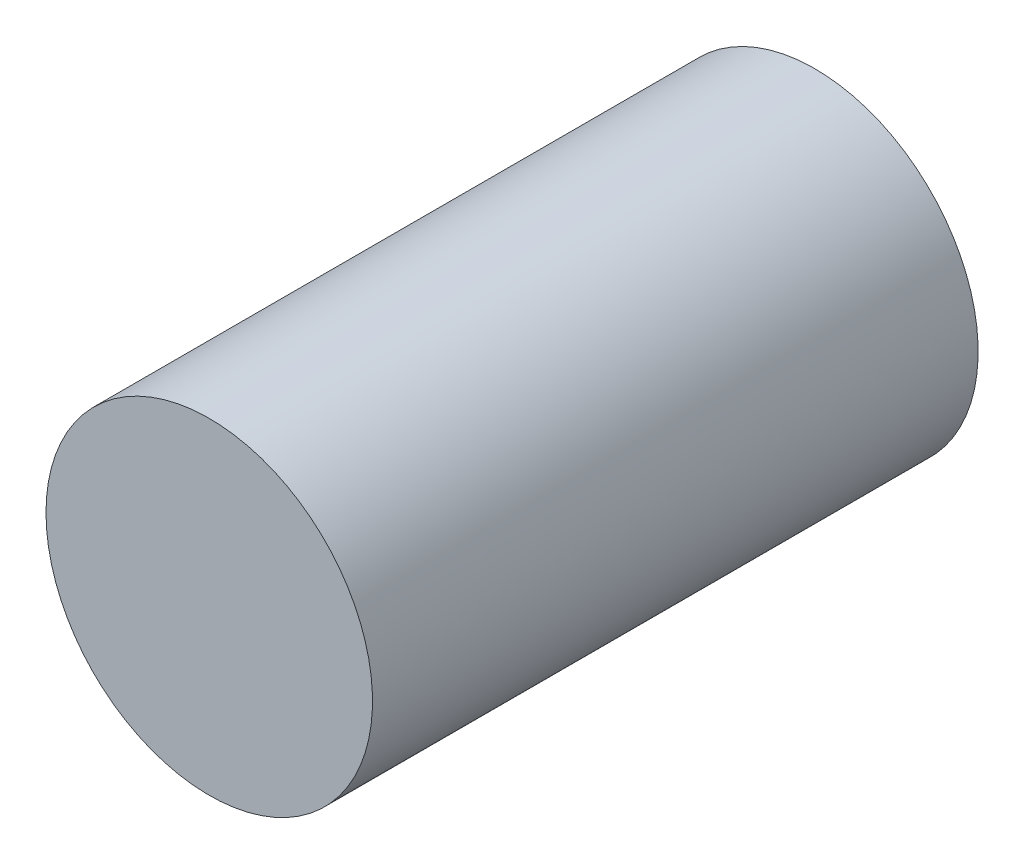
ISO-10303-21;
HEADER;
FILE_DESCRIPTION(('STEP AP214'),'2;1');
FILE_NAME('part.step','',(''),(''),'','','');
FILE_SCHEMA(('AUTOMOTIVE_DESIGN { 1 0 10303 214 1 1 1 1 }'));
ENDSEC;
DATA;
#1=APPLICATION_CONTEXT('core data for automotive mechanical design processes');
#2=APPLICATION_PROTOCOL_DEFINITION('international standard','automotive_design',2000,#1);
#3=PRODUCT_CONTEXT('',#1,'mechanical');
#4=PRODUCT('Part','Part','',(#3));
#5=PRODUCT_RELATED_PRODUCT_CATEGORY('part','',(#4));
#6=PRODUCT_DEFINITION_FORMATION('','',#4);
#7=PRODUCT_DEFINITION_CONTEXT('part definition',#1,'design');
#8=PRODUCT_DEFINITION('design','',#6,#7);
#9=PRODUCT_DEFINITION_SHAPE('','',#8);
#10=(LENGTH_UNIT() NAMED_UNIT(*) SI_UNIT(.MILLI.,.METRE.));
#11=(NAMED_UNIT(*) PLANE_ANGLE_UNIT() SI_UNIT($,.RADIAN.));
#12=(NAMED_UNIT(*) SI_UNIT($,.STERADIAN.) SOLID_ANGLE_UNIT());
#13=UNCERTAINTY_MEASURE_WITH_UNIT(LENGTH_MEASURE(1.E-05),#10,'distance_accuracy_value','');
#14=(GEOMETRIC_REPRESENTATION_CONTEXT(3) GLOBAL_UNCERTAINTY_ASSIGNED_CONTEXT((#13)) GLOBAL_UNIT_ASSIGNED_CONTEXT((#10,
#11,#12)) REPRESENTATION_CONTEXT('',''));
#15=CARTESIAN_POINT('',(0.,0.,0.));
#16=DIRECTION('',(0.,0.,1.));
#17=DIRECTION('',(1.,0.,0.));
#18=AXIS2_PLACEMENT_3D('',#15,#16,#17);
#19=CARTESIAN_POINT('',(0.7874,0.,0.));
#20=DIRECTION('',(0.,0.,-1.));
#21=DIRECTION('',(-1.,0.,0.));
#22=AXIS2_PLACEMENT_3D('',#19,#20,#21);
#23=PLANE('',#22);
#24=CARTESIAN_POINT('',(0.,0.,0.));
#25=DIRECTION('',(0.,0.,-1.));
#26=DIRECTION('',(-1.,0.,0.));
#27=AXIS2_PLACEMENT_3D('',#24,#25,#26);
#28=CIRCLE('',#27,0.7874);
#29=CARTESIAN_POINT('',(-0.7874,0.,0.));
#30=VERTEX_POINT('',#29);
#31=EDGE_CURVE('E18',#30,#30,#28,.F.);
#32=ORIENTED_EDGE('',*,*,#31,.F.);
#33=EDGE_LOOP('',(#32));
#34=FACE_BOUND('',#33,.T.);
#35=ADVANCED_FACE('F15',(#34),#23,.T.);
#36=CARTESIAN_POINT('',(0.7874,0.,2.921));
#37=DIRECTION('',(0.,0.,-1.));
#38=DIRECTION('',(-1.,0.,0.));
#39=AXIS2_PLACEMENT_3D('',#36,#37,#38);
#40=PLANE('',#39);
#41=CARTESIAN_POINT('',(0.,0.,2.921));
#42=DIRECTION('',(0.,0.,-1.));
#43=DIRECTION('',(-1.,0.,0.));
#44=AXIS2_PLACEMENT_3D('',#41,#42,#43);
#45=CIRCLE('',#44,0.7874);
#46=CARTESIAN_POINT('',(-0.7874,0.,2.921));
#47=VERTEX_POINT('',#46);
#48=EDGE_CURVE('E10',#47,#47,#45,.T.);
#49=ORIENTED_EDGE('',*,*,#48,.F.);
#50=EDGE_LOOP('',(#49));
#51=FACE_BOUND('',#50,.T.);
#52=ADVANCED_FACE('F30',(#51),#40,.F.);
#53=CARTESIAN_POINT('',(0.,0.,0.));
#54=DIRECTION('',(0.,0.,-1.));
#55=DIRECTION('',(-1.,0.,0.));
#56=AXIS2_PLACEMENT_3D('',#53,#54,#55);
#57=CYLINDRICAL_SURFACE('',#56,0.7874);
#58=ORIENTED_EDGE('',*,*,#31,.T.);
#59=EDGE_LOOP('',(#58));
#60=FACE_BOUND('',#59,.T.);
#61=ORIENTED_EDGE('',*,*,#48,.T.);
#62=EDGE_LOOP('',(#61));
#63=FACE_BOUND('',#62,.T.);
#64=ADVANCED_FACE('F27',(#60,#63),#57,.T.);
#65=CLOSED_SHELL('',(#35,#52,#64));
#66=MANIFOLD_SOLID_BREP('B1',#65);
#67=ADVANCED_BREP_SHAPE_REPRESENTATION('',(#18,#66),#14);
#68=SHAPE_DEFINITION_REPRESENTATION(#9,#67);
ENDSEC;
END-ISO-10303-21;
